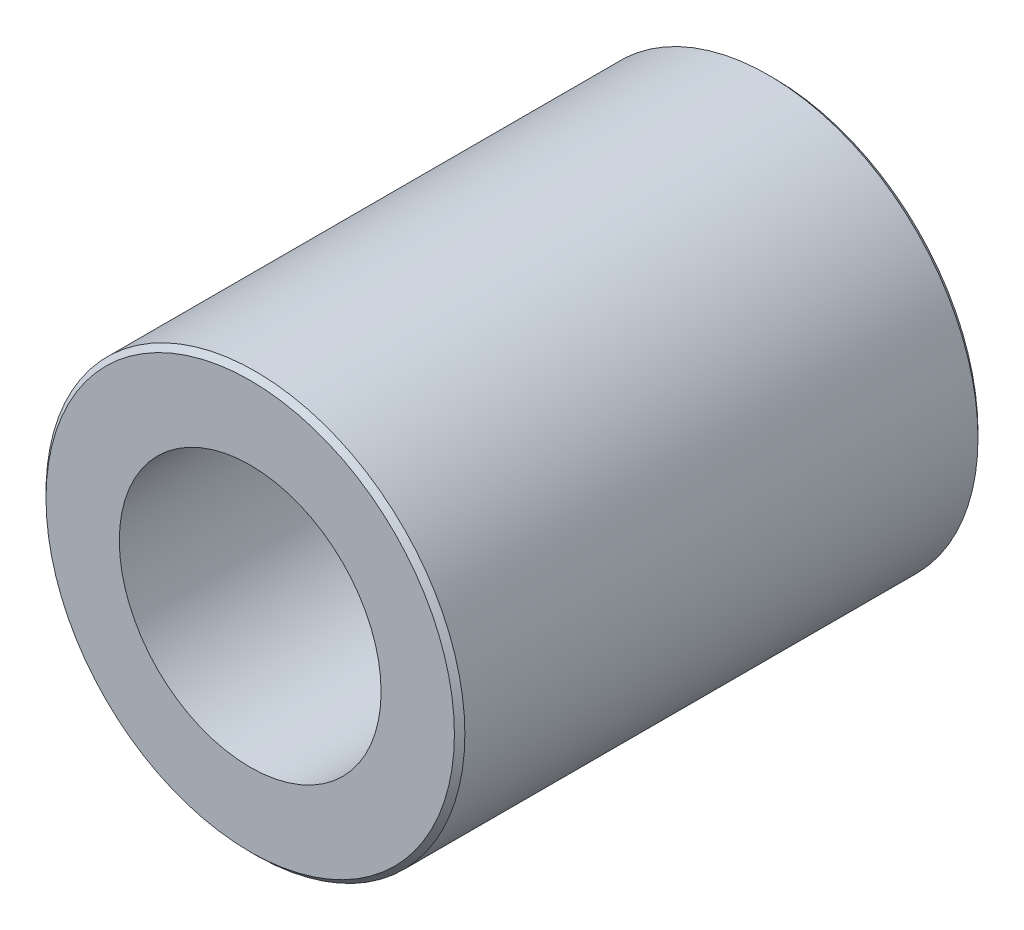
ISO-10303-21;
HEADER;
FILE_DESCRIPTION(('STEP AP214'),'2;1');
FILE_NAME('part.step','',(''),(''),'','','');
FILE_SCHEMA(('AUTOMOTIVE_DESIGN { 1 0 10303 214 1 1 1 1 }'));
ENDSEC;
DATA;
#1=APPLICATION_CONTEXT('core data for automotive mechanical design processes');
#2=APPLICATION_PROTOCOL_DEFINITION('international standard','automotive_design',2000,#1);
#3=PRODUCT_CONTEXT('',#1,'mechanical');
#4=PRODUCT('Part','Part','',(#3));
#5=PRODUCT_RELATED_PRODUCT_CATEGORY('part','',(#4));
#6=PRODUCT_DEFINITION_FORMATION('','',#4);
#7=PRODUCT_DEFINITION_CONTEXT('part definition',#1,'design');
#8=PRODUCT_DEFINITION('design','',#6,#7);
#9=PRODUCT_DEFINITION_SHAPE('','',#8);
#10=(LENGTH_UNIT() NAMED_UNIT(*) SI_UNIT(.MILLI.,.METRE.));
#11=(NAMED_UNIT(*) PLANE_ANGLE_UNIT() SI_UNIT($,.RADIAN.));
#12=(NAMED_UNIT(*) SI_UNIT($,.STERADIAN.) SOLID_ANGLE_UNIT());
#13=UNCERTAINTY_MEASURE_WITH_UNIT(LENGTH_MEASURE(1.E-05),#10,'distance_accuracy_value','');
#14=(GEOMETRIC_REPRESENTATION_CONTEXT(3) GLOBAL_UNCERTAINTY_ASSIGNED_CONTEXT((#13)) GLOBAL_UNIT_ASSIGNED_CONTEXT((#10,
#11,#12)) REPRESENTATION_CONTEXT('',''));
#15=CARTESIAN_POINT('',(0.,0.,0.));
#16=DIRECTION('',(0.,0.,1.));
#17=DIRECTION('',(1.,0.,0.));
#18=AXIS2_PLACEMENT_3D('',#15,#16,#17);
#19=CARTESIAN_POINT('',(0.,0.,5.));
#20=DIRECTION('',(0.,0.,1.));
#21=DIRECTION('',(1.,0.,0.));
#22=AXIS2_PLACEMENT_3D('',#19,#20,#21);
#23=PLANE('',#22);
#24=CARTESIAN_POINT('',(0.,0.,5.));
#25=DIRECTION('',(0.,0.,1.));
#26=DIRECTION('',(1.,0.,0.));
#27=AXIS2_PLACEMENT_3D('',#24,#25,#26);
#28=CIRCLE('',#27,1.24999999999999);
#29=CARTESIAN_POINT('',(1.24999999999999,0.,5.));
#30=VERTEX_POINT('',#29);
#31=EDGE_CURVE('E53',#30,#30,#28,.T.);
#32=ORIENTED_EDGE('',*,*,#31,.F.);
#33=EDGE_LOOP('',(#32));
#34=FACE_BOUND('',#33,.T.);
#35=CARTESIAN_POINT('',(0.,0.,5.));
#36=DIRECTION('',(0.,0.,1.));
#37=DIRECTION('',(1.,0.,0.));
#38=AXIS2_PLACEMENT_3D('',#35,#36,#37);
#39=CIRCLE('',#38,1.95);
#40=CARTESIAN_POINT('',(1.95,0.,5.));
#41=VERTEX_POINT('',#40);
#42=EDGE_CURVE('E10',#41,#41,#39,.T.);
#43=ORIENTED_EDGE('',*,*,#42,.T.);
#44=EDGE_LOOP('',(#43));
#45=FACE_BOUND('',#44,.T.);
#46=ADVANCED_FACE('F33',(#34,#45),#23,.T.);
#47=CARTESIAN_POINT('',(0.,0.,0.));
#48=DIRECTION('',(0.,0.,1.));
#49=DIRECTION('',(1.,0.,0.));
#50=AXIS2_PLACEMENT_3D('',#47,#48,#49);
#51=PLANE('',#50);
#52=CARTESIAN_POINT('',(0.,0.,0.));
#53=DIRECTION('',(0.,0.,-1.));
#54=DIRECTION('',(-1.,0.,0.));
#55=AXIS2_PLACEMENT_3D('',#52,#53,#54);
#56=CIRCLE('',#55,1.24999999999999);
#57=CARTESIAN_POINT('',(-1.24999999999999,0.,0.));
#58=VERTEX_POINT('',#57);
#59=EDGE_CURVE('E56',#58,#58,#56,.T.);
#60=ORIENTED_EDGE('',*,*,#59,.F.);
#61=EDGE_LOOP('',(#60));
#62=FACE_BOUND('',#61,.T.);
#63=CARTESIAN_POINT('',(0.,0.,0.));
#64=DIRECTION('',(0.,0.,1.));
#65=DIRECTION('',(1.,0.,0.));
#66=AXIS2_PLACEMENT_3D('',#63,#64,#65);
#67=CIRCLE('',#66,1.95);
#68=CARTESIAN_POINT('',(1.95,0.,0.));
#69=VERTEX_POINT('',#68);
#70=EDGE_CURVE('E40',#69,#69,#67,.F.);
#71=ORIENTED_EDGE('',*,*,#70,.T.);
#72=EDGE_LOOP('',(#71));
#73=FACE_BOUND('',#72,.T.);
#74=ADVANCED_FACE('F63',(#62,#73),#51,.F.);
#75=CARTESIAN_POINT('',(0.,0.,5.));
#76=DIRECTION('',(0.,0.,-1.));
#77=DIRECTION('',(-1.,0.,0.));
#78=AXIS2_PLACEMENT_3D('',#75,#76,#77);
#79=CYLINDRICAL_SURFACE('',#78,2.);
#80=CARTESIAN_POINT('',(0.,0.,0.0500000000000006));
#81=DIRECTION('',(0.,0.,1.));
#82=DIRECTION('',(1.,0.,0.));
#83=AXIS2_PLACEMENT_3D('',#80,#81,#82);
#84=CIRCLE('',#83,2.);
#85=CARTESIAN_POINT('',(2.,0.,0.0500000000000006));
#86=VERTEX_POINT('',#85);
#87=EDGE_CURVE('E44',#86,#86,#84,.T.);
#88=ORIENTED_EDGE('',*,*,#87,.T.);
#89=EDGE_LOOP('',(#88));
#90=FACE_BOUND('',#89,.T.);
#91=CARTESIAN_POINT('',(0.,0.,4.95));
#92=DIRECTION('',(0.,0.,1.));
#93=DIRECTION('',(1.,0.,0.));
#94=AXIS2_PLACEMENT_3D('',#91,#92,#93);
#95=CIRCLE('',#94,2.);
#96=CARTESIAN_POINT('',(2.,0.,4.95));
#97=VERTEX_POINT('',#96);
#98=EDGE_CURVE('E48',#97,#97,#95,.F.);
#99=ORIENTED_EDGE('',*,*,#98,.T.);
#100=EDGE_LOOP('',(#99));
#101=FACE_BOUND('',#100,.T.);
#102=ADVANCED_FACE('F65',(#90,#101),#79,.T.);
#103=CARTESIAN_POINT('',(0.,0.,0.0500000000000006));
#104=DIRECTION('',(0.,0.,1.));
#105=DIRECTION('',(1.,0.,0.));
#106=AXIS2_PLACEMENT_3D('',#103,#104,#105);
#107=CONICAL_SURFACE('',#106,2.,0.785398163397444);
#108=ORIENTED_EDGE('',*,*,#70,.F.);
#109=EDGE_LOOP('',(#108));
#110=FACE_BOUND('',#109,.T.);
#111=ORIENTED_EDGE('',*,*,#87,.F.);
#112=EDGE_LOOP('',(#111));
#113=FACE_BOUND('',#112,.T.);
#114=ADVANCED_FACE('F71',(#110,#113),#107,.T.);
#115=CARTESIAN_POINT('',(0.,0.,5.));
#116=DIRECTION('',(0.,0.,-1.));
#117=DIRECTION('',(-1.,0.,0.));
#118=AXIS2_PLACEMENT_3D('',#115,#116,#117);
#119=CONICAL_SURFACE('',#118,1.95,0.78539816339744);
#120=ORIENTED_EDGE('',*,*,#98,.F.);
#121=EDGE_LOOP('',(#120));
#122=FACE_BOUND('',#121,.T.);
#123=ORIENTED_EDGE('',*,*,#42,.F.);
#124=EDGE_LOOP('',(#123));
#125=FACE_BOUND('',#124,.T.);
#126=ADVANCED_FACE('F35',(#122,#125),#119,.T.);
#127=CARTESIAN_POINT('',(0.,0.,0.));
#128=DIRECTION('',(0.,0.,-1.));
#129=DIRECTION('',(-1.,0.,0.));
#130=AXIS2_PLACEMENT_3D('',#127,#128,#129);
#131=CYLINDRICAL_SURFACE('',#130,1.24999999999999);
#132=ORIENTED_EDGE('',*,*,#59,.T.);
#133=EDGE_LOOP('',(#132));
#134=FACE_BOUND('',#133,.T.);
#135=ORIENTED_EDGE('',*,*,#31,.T.);
#136=EDGE_LOOP('',(#135));
#137=FACE_BOUND('',#136,.T.);
#138=ADVANCED_FACE('F60',(#134,#137),#131,.F.);
#139=CLOSED_SHELL('',(#46,#74,#102,#114,#126,#138));
#140=MANIFOLD_SOLID_BREP('B2',#139);
#141=ADVANCED_BREP_SHAPE_REPRESENTATION('',(#18,#140),#14);
#142=SHAPE_DEFINITION_REPRESENTATION(#9,#141);
ENDSEC;
END-ISO-10303-21;
